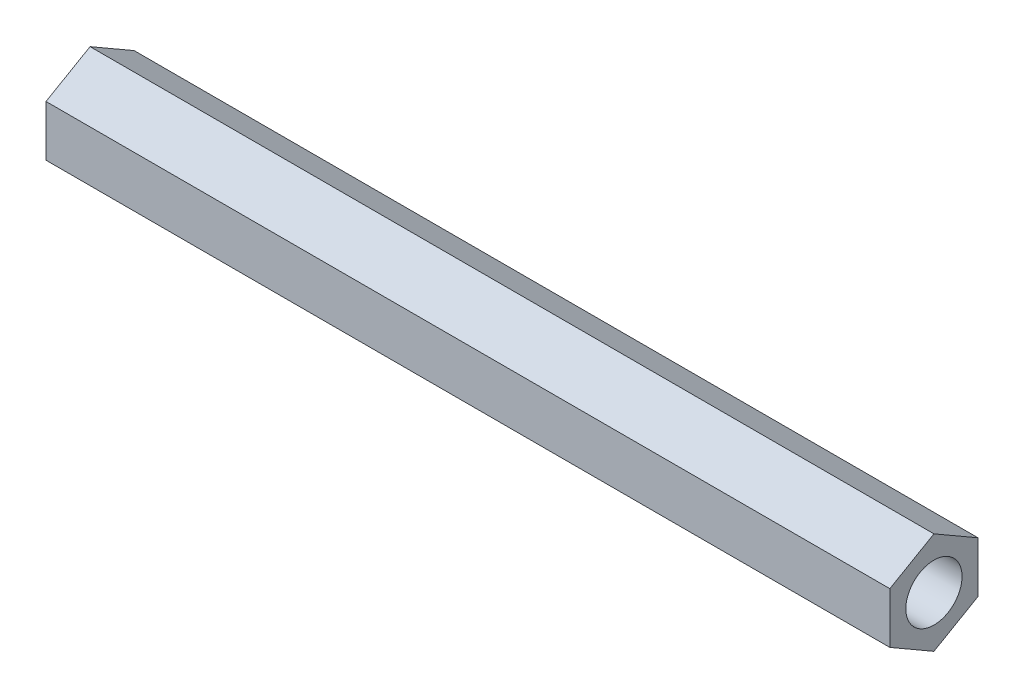
ISO-10303-21;
HEADER;
FILE_DESCRIPTION(('STEP AP214'),'2;1');
FILE_NAME('part.step','',(''),(''),'','','');
FILE_SCHEMA(('AUTOMOTIVE_DESIGN { 1 0 10303 214 1 1 1 1 }'));
ENDSEC;
DATA;
#1=APPLICATION_CONTEXT('core data for automotive mechanical design processes');
#2=APPLICATION_PROTOCOL_DEFINITION('international standard','automotive_design',2000,#1);
#3=PRODUCT_CONTEXT('',#1,'mechanical');
#4=PRODUCT('Part','Part','',(#3));
#5=PRODUCT_RELATED_PRODUCT_CATEGORY('part','',(#4));
#6=PRODUCT_DEFINITION_FORMATION('','',#4);
#7=PRODUCT_DEFINITION_CONTEXT('part definition',#1,'design');
#8=PRODUCT_DEFINITION('design','',#6,#7);
#9=PRODUCT_DEFINITION_SHAPE('','',#8);
#10=(LENGTH_UNIT() NAMED_UNIT(*) SI_UNIT(.MILLI.,.METRE.));
#11=(NAMED_UNIT(*) PLANE_ANGLE_UNIT() SI_UNIT($,.RADIAN.));
#12=(NAMED_UNIT(*) SI_UNIT($,.STERADIAN.) SOLID_ANGLE_UNIT());
#13=UNCERTAINTY_MEASURE_WITH_UNIT(LENGTH_MEASURE(1.E-05),#10,'distance_accuracy_value','');
#14=(GEOMETRIC_REPRESENTATION_CONTEXT(3) GLOBAL_UNCERTAINTY_ASSIGNED_CONTEXT((#13)) GLOBAL_UNIT_ASSIGNED_CONTEXT((#10,
#11,#12)) REPRESENTATION_CONTEXT('',''));
#15=CARTESIAN_POINT('',(0.,0.,0.));
#16=DIRECTION('',(0.,0.,1.));
#17=DIRECTION('',(1.,0.,0.));
#18=AXIS2_PLACEMENT_3D('',#15,#16,#17);
#19=CARTESIAN_POINT('',(45.,0.,0.));
#20=DIRECTION('',(1.,0.,0.));
#21=DIRECTION('',(0.,0.,-1.));
#22=AXIS2_PLACEMENT_3D('',#19,#20,#21);
#23=PLANE('',#22);
#24=DIRECTION('',(0.,1.,0.));
#25=VECTOR('',#24,1.);
#26=CARTESIAN_POINT('',(45.,-1.35677313259562,-2.35));
#27=LINE('',#26,#25);
#28=CARTESIAN_POINT('',(45.,-1.35677313259562,-2.35));
#29=VERTEX_POINT('',#28);
#30=CARTESIAN_POINT('',(45.,1.35677313259562,-2.35));
#31=VERTEX_POINT('',#30);
#32=EDGE_CURVE('E132',#29,#31,#27,.T.);
#33=ORIENTED_EDGE('',*,*,#32,.T.);
#34=DIRECTION('',(0.,0.5,0.866025403784439));
#35=VECTOR('',#34,1.);
#36=CARTESIAN_POINT('',(45.,1.35677313259562,-2.35));
#37=LINE('',#36,#35);
#38=CARTESIAN_POINT('',(45.,2.71354626519124,0.));
#39=VERTEX_POINT('',#38);
#40=EDGE_CURVE('E90',#31,#39,#37,.T.);
#41=ORIENTED_EDGE('',*,*,#40,.T.);
#42=DIRECTION('',(0.,-0.5,0.866025403784438));
#43=VECTOR('',#42,1.);
#44=CARTESIAN_POINT('',(45.,2.71354626519124,0.));
#45=LINE('',#44,#43);
#46=CARTESIAN_POINT('',(45.,1.35677313259562,2.35));
#47=VERTEX_POINT('',#46);
#48=EDGE_CURVE('E103',#39,#47,#45,.T.);
#49=ORIENTED_EDGE('',*,*,#48,.T.);
#50=DIRECTION('',(0.,-1.,0.));
#51=VECTOR('',#50,1.);
#52=CARTESIAN_POINT('',(45.,1.35677313259562,2.35));
#53=LINE('',#52,#51);
#54=CARTESIAN_POINT('',(45.,-1.35677313259562,2.35));
#55=VERTEX_POINT('',#54);
#56=EDGE_CURVE('E97',#47,#55,#53,.T.);
#57=ORIENTED_EDGE('',*,*,#56,.T.);
#58=DIRECTION('',(0.,-0.5,-0.866025403784439));
#59=VECTOR('',#58,1.);
#60=CARTESIAN_POINT('',(45.,-1.35677313259562,2.35));
#61=LINE('',#60,#59);
#62=CARTESIAN_POINT('',(45.,-2.71354626519124,0.));
#63=VERTEX_POINT('',#62);
#64=EDGE_CURVE('E101',#55,#63,#61,.T.);
#65=ORIENTED_EDGE('',*,*,#64,.T.);
#66=DIRECTION('',(0.,0.5,-0.866025403784438));
#67=VECTOR('',#66,1.);
#68=CARTESIAN_POINT('',(45.,-2.71354626519124,0.));
#69=LINE('',#68,#67);
#70=EDGE_CURVE('E53',#63,#29,#69,.T.);
#71=ORIENTED_EDGE('',*,*,#70,.T.);
#72=EDGE_LOOP('',(#33,#41,#49,#57,#65,#71));
#73=FACE_BOUND('',#72,.T.);
#74=CARTESIAN_POINT('',(45.,0.,0.));
#75=DIRECTION('',(1.,0.,0.));
#76=DIRECTION('',(0.,0.,-1.));
#77=AXIS2_PLACEMENT_3D('',#74,#75,#76);
#78=CIRCLE('',#77,1.5);
#79=CARTESIAN_POINT('',(45.,0.,1.5));
#80=VERTEX_POINT('',#79);
#81=EDGE_CURVE('E125',#80,#80,#78,.T.);
#82=ORIENTED_EDGE('',*,*,#81,.F.);
#83=EDGE_LOOP('',(#82));
#84=FACE_BOUND('',#83,.T.);
#85=ADVANCED_FACE('F36',(#73,#84),#23,.T.);
#86=CARTESIAN_POINT('',(0.,0.,0.));
#87=DIRECTION('',(1.,0.,0.));
#88=DIRECTION('',(0.,0.,-1.));
#89=AXIS2_PLACEMENT_3D('',#86,#87,#88);
#90=PLANE('',#89);
#91=DIRECTION('',(0.,1.,0.));
#92=VECTOR('',#91,1.);
#93=CARTESIAN_POINT('',(0.,-1.35677313259562,-2.35));
#94=LINE('',#93,#92);
#95=CARTESIAN_POINT('',(0.,-1.35677313259562,-2.35));
#96=VERTEX_POINT('',#95);
#97=CARTESIAN_POINT('',(0.,1.35677313259562,-2.35));
#98=VERTEX_POINT('',#97);
#99=EDGE_CURVE('E121',#96,#98,#94,.T.);
#100=ORIENTED_EDGE('',*,*,#99,.F.);
#101=DIRECTION('',(0.,0.5,-0.866025403784438));
#102=VECTOR('',#101,1.);
#103=CARTESIAN_POINT('',(0.,-2.71354626519124,0.));
#104=LINE('',#103,#102);
#105=CARTESIAN_POINT('',(0.,-2.71354626519124,0.));
#106=VERTEX_POINT('',#105);
#107=EDGE_CURVE('E82',#106,#96,#104,.T.);
#108=ORIENTED_EDGE('',*,*,#107,.F.);
#109=DIRECTION('',(0.,-0.5,-0.866025403784439));
#110=VECTOR('',#109,1.);
#111=CARTESIAN_POINT('',(0.,-1.35677313259562,2.35));
#112=LINE('',#111,#110);
#113=CARTESIAN_POINT('',(0.,-1.35677313259562,2.35));
#114=VERTEX_POINT('',#113);
#115=EDGE_CURVE('E76',#114,#106,#112,.T.);
#116=ORIENTED_EDGE('',*,*,#115,.F.);
#117=DIRECTION('',(0.,-1.,0.));
#118=VECTOR('',#117,1.);
#119=CARTESIAN_POINT('',(0.,1.35677313259562,2.35));
#120=LINE('',#119,#118);
#121=CARTESIAN_POINT('',(0.,1.35677313259562,2.35));
#122=VERTEX_POINT('',#121);
#123=EDGE_CURVE('E111',#122,#114,#120,.T.);
#124=ORIENTED_EDGE('',*,*,#123,.F.);
#125=DIRECTION('',(0.,-0.5,0.866025403784438));
#126=VECTOR('',#125,1.);
#127=CARTESIAN_POINT('',(0.,2.71354626519124,0.));
#128=LINE('',#127,#126);
#129=CARTESIAN_POINT('',(0.,2.71354626519124,0.));
#130=VERTEX_POINT('',#129);
#131=EDGE_CURVE('E127',#130,#122,#128,.T.);
#132=ORIENTED_EDGE('',*,*,#131,.F.);
#133=DIRECTION('',(0.,0.5,0.866025403784439));
#134=VECTOR('',#133,1.);
#135=CARTESIAN_POINT('',(0.,1.35677313259562,-2.35));
#136=LINE('',#135,#134);
#137=EDGE_CURVE('E124',#98,#130,#136,.T.);
#138=ORIENTED_EDGE('',*,*,#137,.F.);
#139=EDGE_LOOP('',(#100,#108,#116,#124,#132,#138));
#140=FACE_BOUND('',#139,.T.);
#141=CARTESIAN_POINT('',(0.,0.,0.));
#142=DIRECTION('',(1.,0.,0.));
#143=DIRECTION('',(0.,0.,-1.));
#144=AXIS2_PLACEMENT_3D('',#141,#142,#143);
#145=CIRCLE('',#144,1.5);
#146=CARTESIAN_POINT('',(0.,0.,1.5));
#147=VERTEX_POINT('',#146);
#148=EDGE_CURVE('E243',#147,#147,#145,.T.);
#149=ORIENTED_EDGE('',*,*,#148,.T.);
#150=EDGE_LOOP('',(#149));
#151=FACE_BOUND('',#150,.T.);
#152=ADVANCED_FACE('F141',(#140,#151),#90,.F.);
#153=CARTESIAN_POINT('',(45.,-1.35677313259562,-2.35));
#154=DIRECTION('',(0.,0.,1.));
#155=DIRECTION('',(1.,0.,0.));
#156=AXIS2_PLACEMENT_3D('',#153,#154,#155);
#157=PLANE('',#156);
#158=ORIENTED_EDGE('',*,*,#99,.T.);
#159=DIRECTION('',(-1.,0.,0.));
#160=VECTOR('',#159,1.);
#161=CARTESIAN_POINT('',(45.,1.35677313259562,-2.35));
#162=LINE('',#161,#160);
#163=EDGE_CURVE('E11',#31,#98,#162,.T.);
#164=ORIENTED_EDGE('',*,*,#163,.F.);
#165=ORIENTED_EDGE('',*,*,#32,.F.);
#166=DIRECTION('',(-1.,0.,0.));
#167=VECTOR('',#166,1.);
#168=CARTESIAN_POINT('',(45.,-1.35677313259562,-2.35));
#169=LINE('',#168,#167);
#170=EDGE_CURVE('E117',#29,#96,#169,.T.);
#171=ORIENTED_EDGE('',*,*,#170,.T.);
#172=EDGE_LOOP('',(#158,#164,#165,#171));
#173=FACE_BOUND('',#172,.T.);
#174=ADVANCED_FACE('F38',(#173),#157,.F.);
#175=CARTESIAN_POINT('',(45.,1.35677313259562,-2.35));
#176=DIRECTION('',(0.,-0.866025403784439,0.5));
#177=DIRECTION('',(0.,-0.5,-0.866025403784439));
#178=AXIS2_PLACEMENT_3D('',#175,#176,#177);
#179=PLANE('',#178);
#180=ORIENTED_EDGE('',*,*,#137,.T.);
#181=DIRECTION('',(-1.,0.,0.));
#182=VECTOR('',#181,1.);
#183=CARTESIAN_POINT('',(45.,2.71354626519124,0.));
#184=LINE('',#183,#182);
#185=EDGE_CURVE('E45',#39,#130,#184,.T.);
#186=ORIENTED_EDGE('',*,*,#185,.F.);
#187=ORIENTED_EDGE('',*,*,#40,.F.);
#188=ORIENTED_EDGE('',*,*,#163,.T.);
#189=EDGE_LOOP('',(#180,#186,#187,#188));
#190=FACE_BOUND('',#189,.T.);
#191=ADVANCED_FACE('F166',(#190),#179,.F.);
#192=CARTESIAN_POINT('',(45.,2.71354626519124,0.));
#193=DIRECTION('',(0.,-0.866025403784438,-0.5));
#194=DIRECTION('',(0.,0.5,-0.866025403784439));
#195=AXIS2_PLACEMENT_3D('',#192,#193,#194);
#196=PLANE('',#195);
#197=ORIENTED_EDGE('',*,*,#131,.T.);
#198=DIRECTION('',(-1.,0.,0.));
#199=VECTOR('',#198,1.);
#200=CARTESIAN_POINT('',(45.,1.35677313259562,2.35));
#201=LINE('',#200,#199);
#202=EDGE_CURVE('E112',#47,#122,#201,.T.);
#203=ORIENTED_EDGE('',*,*,#202,.F.);
#204=ORIENTED_EDGE('',*,*,#48,.F.);
#205=ORIENTED_EDGE('',*,*,#185,.T.);
#206=EDGE_LOOP('',(#197,#203,#204,#205));
#207=FACE_BOUND('',#206,.T.);
#208=ADVANCED_FACE('F138',(#207),#196,.F.);
#209=CARTESIAN_POINT('',(45.,1.35677313259562,2.35));
#210=DIRECTION('',(0.,0.,-1.));
#211=DIRECTION('',(-1.,0.,0.));
#212=AXIS2_PLACEMENT_3D('',#209,#210,#211);
#213=PLANE('',#212);
#214=ORIENTED_EDGE('',*,*,#123,.T.);
#215=DIRECTION('',(-1.,0.,0.));
#216=VECTOR('',#215,1.);
#217=CARTESIAN_POINT('',(45.,-1.35677313259562,2.35));
#218=LINE('',#217,#216);
#219=EDGE_CURVE('E108',#55,#114,#218,.T.);
#220=ORIENTED_EDGE('',*,*,#219,.F.);
#221=ORIENTED_EDGE('',*,*,#56,.F.);
#222=ORIENTED_EDGE('',*,*,#202,.T.);
#223=EDGE_LOOP('',(#214,#220,#221,#222));
#224=FACE_BOUND('',#223,.T.);
#225=ADVANCED_FACE('F109',(#224),#213,.F.);
#226=CARTESIAN_POINT('',(45.,-1.35677313259562,2.35));
#227=DIRECTION('',(0.,0.866025403784439,-0.5));
#228=DIRECTION('',(0.,0.5,0.866025403784439));
#229=AXIS2_PLACEMENT_3D('',#226,#227,#228);
#230=PLANE('',#229);
#231=ORIENTED_EDGE('',*,*,#115,.T.);
#232=DIRECTION('',(-1.,0.,0.));
#233=VECTOR('',#232,1.);
#234=CARTESIAN_POINT('',(45.,-2.71354626519124,0.));
#235=LINE('',#234,#233);
#236=EDGE_CURVE('E113',#63,#106,#235,.T.);
#237=ORIENTED_EDGE('',*,*,#236,.F.);
#238=ORIENTED_EDGE('',*,*,#64,.F.);
#239=ORIENTED_EDGE('',*,*,#219,.T.);
#240=EDGE_LOOP('',(#231,#237,#238,#239));
#241=FACE_BOUND('',#240,.T.);
#242=ADVANCED_FACE('F115',(#241),#230,.F.);
#243=CARTESIAN_POINT('',(45.,-2.71354626519124,0.));
#244=DIRECTION('',(0.,0.866025403784439,0.5));
#245=DIRECTION('',(0.,-0.5,0.866025403784439));
#246=AXIS2_PLACEMENT_3D('',#243,#244,#245);
#247=PLANE('',#246);
#248=ORIENTED_EDGE('',*,*,#107,.T.);
#249=ORIENTED_EDGE('',*,*,#170,.F.);
#250=ORIENTED_EDGE('',*,*,#70,.F.);
#251=ORIENTED_EDGE('',*,*,#236,.T.);
#252=EDGE_LOOP('',(#248,#249,#250,#251));
#253=FACE_BOUND('',#252,.T.);
#254=ADVANCED_FACE('F146',(#253),#247,.F.);
#255=CARTESIAN_POINT('',(45.,0.,0.));
#256=DIRECTION('',(-1.,0.,0.));
#257=DIRECTION('',(0.,0.,1.));
#258=AXIS2_PLACEMENT_3D('',#255,#256,#257);
#259=CYLINDRICAL_SURFACE('',#258,1.5);
#260=CARTESIAN_POINT('',(45.,0.,1.5));
#261=CARTESIAN_POINT('',(44.53125,0.,1.5));
#262=CARTESIAN_POINT('',(44.0625,0.,1.5));
#263=CARTESIAN_POINT('',(43.125,0.,1.5));
#264=CARTESIAN_POINT('',(42.65625,0.,1.5));
#265=CARTESIAN_POINT('',(41.71875,0.,1.5));
#266=CARTESIAN_POINT('',(41.25,0.,1.5));
#267=CARTESIAN_POINT('',(40.3125,0.,1.5));
#268=CARTESIAN_POINT('',(39.84375,0.,1.5));
#269=CARTESIAN_POINT('',(38.90625,0.,1.5));
#270=CARTESIAN_POINT('',(38.4375,0.,1.5));
#271=CARTESIAN_POINT('',(37.5,0.,1.5));
#272=CARTESIAN_POINT('',(37.03125,0.,1.5));
#273=CARTESIAN_POINT('',(36.09375,0.,1.5));
#274=CARTESIAN_POINT('',(35.625,0.,1.5));
#275=CARTESIAN_POINT('',(34.6875,0.,1.5));
#276=CARTESIAN_POINT('',(34.21875,0.,1.5));
#277=CARTESIAN_POINT('',(33.28125,0.,1.5));
#278=CARTESIAN_POINT('',(32.8125,0.,1.5));
#279=CARTESIAN_POINT('',(31.875,0.,1.5));
#280=CARTESIAN_POINT('',(31.40625,0.,1.5));
#281=CARTESIAN_POINT('',(30.46875,0.,1.5));
#282=CARTESIAN_POINT('',(30.,0.,1.5));
#283=CARTESIAN_POINT('',(29.0625,0.,1.5));
#284=CARTESIAN_POINT('',(28.59375,0.,1.5));
#285=CARTESIAN_POINT('',(27.65625,0.,1.5));
#286=CARTESIAN_POINT('',(27.1875,0.,1.5));
#287=CARTESIAN_POINT('',(26.25,0.,1.5));
#288=CARTESIAN_POINT('',(25.78125,0.,1.5));
#289=CARTESIAN_POINT('',(24.84375,0.,1.5));
#290=CARTESIAN_POINT('',(24.375,0.,1.5));
#291=CARTESIAN_POINT('',(23.4375,0.,1.5));
#292=CARTESIAN_POINT('',(22.96875,0.,1.5));
#293=CARTESIAN_POINT('',(22.03125,0.,1.5));
#294=CARTESIAN_POINT('',(21.5625,0.,1.5));
#295=CARTESIAN_POINT('',(20.625,0.,1.5));
#296=CARTESIAN_POINT('',(20.15625,0.,1.5));
#297=CARTESIAN_POINT('',(19.21875,0.,1.5));
#298=CARTESIAN_POINT('',(18.75,0.,1.5));
#299=CARTESIAN_POINT('',(17.8125,0.,1.5));
#300=CARTESIAN_POINT('',(17.34375,0.,1.5));
#301=CARTESIAN_POINT('',(16.40625,0.,1.5));
#302=CARTESIAN_POINT('',(15.9375,0.,1.5));
#303=CARTESIAN_POINT('',(15.,0.,1.5));
#304=CARTESIAN_POINT('',(14.53125,0.,1.5));
#305=CARTESIAN_POINT('',(13.59375,0.,1.5));
#306=CARTESIAN_POINT('',(13.125,0.,1.5));
#307=CARTESIAN_POINT('',(12.1875,0.,1.5));
#308=CARTESIAN_POINT('',(11.71875,0.,1.5));
#309=CARTESIAN_POINT('',(10.78125,0.,1.5));
#310=CARTESIAN_POINT('',(10.3125,0.,1.5));
#311=CARTESIAN_POINT('',(9.37499999999999,0.,1.5));
#312=CARTESIAN_POINT('',(8.90624999999999,0.,1.5));
#313=CARTESIAN_POINT('',(7.96874999999999,0.,1.5));
#314=CARTESIAN_POINT('',(7.5,0.,1.5));
#315=CARTESIAN_POINT('',(6.56249999999999,0.,1.5));
#316=CARTESIAN_POINT('',(6.09374999999999,0.,1.5));
#317=CARTESIAN_POINT('',(5.15624999999999,0.,1.5));
#318=CARTESIAN_POINT('',(4.68749999999999,0.,1.5));
#319=CARTESIAN_POINT('',(3.74999999999999,0.,1.5));
#320=CARTESIAN_POINT('',(3.28124999999999,0.,1.5));
#321=CARTESIAN_POINT('',(2.34374999999999,0.,1.5));
#322=CARTESIAN_POINT('',(1.87499999999999,0.,1.5));
#323=CARTESIAN_POINT('',(0.937499999999992,0.,1.5));
#324=CARTESIAN_POINT('',(0.468749999999993,0.,1.5));
#325=CARTESIAN_POINT('',(0.,0.,1.5));
#326=B_SPLINE_CURVE_WITH_KNOTS('',3,(#260,#261,#262,#263,#264,#265,#266,#267,#268,#269,#270,
#271,#272,#273,#274,#275,#276,#277,#278,#279,#280,#281,#282,#283,#284,#285,#286,#287,#288,#289,
#290,#291,#292,#293,#294,#295,#296,#297,#298,#299,#300,#301,#302,#303,#304,#305,#306,#307,#308,
#309,#310,#311,#312,#313,#314,#315,#316,#317,#318,#319,#320,#321,#322,#323,#324,#325),
.UNSPECIFIED.,.F.,.F.,(4,2,2,2,2,2,2,2,2,2,2,2,2,2,2,2,2,2,2,2,2,2,2,2,2,2,2,2,2,2,2,2,4),(0.,
1.40625,2.8125,4.21874999999999,5.625,7.03125,8.43749999999999,9.84375,11.25,12.65625,14.0625,
15.46875,16.875,18.28125,19.6875,21.09375,22.5,23.90625,25.3125,26.71875,28.125,29.53125,
30.9375,32.34375,33.75,35.15625,36.5625,37.96875,39.375,40.78125,42.1875,43.59375,45.),.UNSPECIFIED.);
#327=EDGE_CURVE('BSEAM148',#80,#147,#326,.T.);
#328=ORIENTED_EDGE('',*,*,#81,.T.);
#329=ORIENTED_EDGE('',*,*,#148,.F.);
#330=ORIENTED_EDGE('',*,*,#327,.T.);
#331=ORIENTED_EDGE('',*,*,#327,.F.);
#332=EDGE_LOOP('',(#328,#330,#329,#331));
#333=FACE_BOUND('',#332,.T.);
#334=ADVANCED_FACE('F148',(#333),#259,.F.);
#335=CLOSED_SHELL('',(#85,#152,#174,#191,#208,#225,#242,#254,#334));
#336=MANIFOLD_SOLID_BREP('B2',#335);
#337=ADVANCED_BREP_SHAPE_REPRESENTATION('',(#18,#336),#14);
#338=SHAPE_DEFINITION_REPRESENTATION(#9,#337);
ENDSEC;
END-ISO-10303-21;
